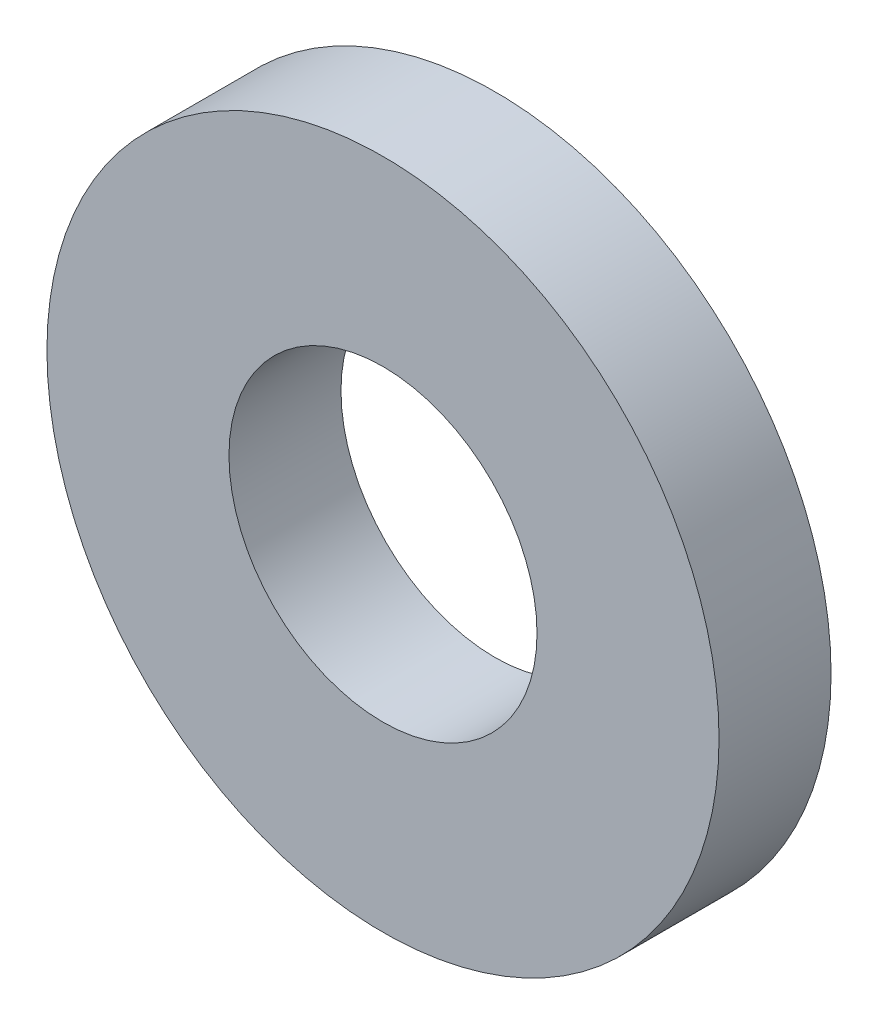
ISO-10303-21;
HEADER;
FILE_DESCRIPTION(('STEP AP214'),'2;1');
FILE_NAME('part.step','',(''),(''),'','','');
FILE_SCHEMA(('AUTOMOTIVE_DESIGN { 1 0 10303 214 1 1 1 1 }'));
ENDSEC;
DATA;
#1=APPLICATION_CONTEXT('core data for automotive mechanical design processes');
#2=APPLICATION_PROTOCOL_DEFINITION('international standard','automotive_design',2000,#1);
#3=PRODUCT_CONTEXT('',#1,'mechanical');
#4=PRODUCT('Part','Part','',(#3));
#5=PRODUCT_RELATED_PRODUCT_CATEGORY('part','',(#4));
#6=PRODUCT_DEFINITION_FORMATION('','',#4);
#7=PRODUCT_DEFINITION_CONTEXT('part definition',#1,'design');
#8=PRODUCT_DEFINITION('design','',#6,#7);
#9=PRODUCT_DEFINITION_SHAPE('','',#8);
#10=(LENGTH_UNIT() NAMED_UNIT(*) SI_UNIT(.MILLI.,.METRE.));
#11=(NAMED_UNIT(*) PLANE_ANGLE_UNIT() SI_UNIT($,.RADIAN.));
#12=(NAMED_UNIT(*) SI_UNIT($,.STERADIAN.) SOLID_ANGLE_UNIT());
#13=UNCERTAINTY_MEASURE_WITH_UNIT(LENGTH_MEASURE(1.E-05),#10,'distance_accuracy_value','');
#14=(GEOMETRIC_REPRESENTATION_CONTEXT(3) GLOBAL_UNCERTAINTY_ASSIGNED_CONTEXT((#13)) GLOBAL_UNIT_ASSIGNED_CONTEXT((#10,
#11,#12)) REPRESENTATION_CONTEXT('',''));
#15=CARTESIAN_POINT('',(0.,0.,0.));
#16=DIRECTION('',(0.,0.,1.));
#17=DIRECTION('',(1.,0.,0.));
#18=AXIS2_PLACEMENT_3D('',#15,#16,#17);
#19=CARTESIAN_POINT('',(0.,0.,2.));
#20=DIRECTION('',(0.,0.,1.));
#21=DIRECTION('',(1.,0.,0.));
#22=AXIS2_PLACEMENT_3D('',#19,#20,#21);
#23=PLANE('',#22);
#24=CARTESIAN_POINT('',(0.,0.,2.));
#25=DIRECTION('',(0.,0.,1.));
#26=DIRECTION('',(1.,0.,0.));
#27=AXIS2_PLACEMENT_3D('',#24,#25,#26);
#28=CIRCLE('',#27,6.);
#29=CARTESIAN_POINT('',(6.,0.,2.));
#30=VERTEX_POINT('',#29);
#31=EDGE_CURVE('E10',#30,#30,#28,.T.);
#32=ORIENTED_EDGE('',*,*,#31,.T.);
#33=EDGE_LOOP('',(#32));
#34=FACE_BOUND('',#33,.T.);
#35=CARTESIAN_POINT('',(0.,0.,2.));
#36=DIRECTION('',(0.,0.,1.));
#37=DIRECTION('',(1.,0.,0.));
#38=AXIS2_PLACEMENT_3D('',#35,#36,#37);
#39=CIRCLE('',#38,2.75);
#40=CARTESIAN_POINT('',(2.75,0.,2.));
#41=VERTEX_POINT('',#40);
#42=EDGE_CURVE('E44',#41,#41,#39,.T.);
#43=ORIENTED_EDGE('',*,*,#42,.F.);
#44=EDGE_LOOP('',(#43));
#45=FACE_BOUND('',#44,.T.);
#46=ADVANCED_FACE('F33',(#34,#45),#23,.T.);
#47=CARTESIAN_POINT('',(0.,0.,0.));
#48=DIRECTION('',(0.,0.,1.));
#49=DIRECTION('',(1.,0.,0.));
#50=AXIS2_PLACEMENT_3D('',#47,#48,#49);
#51=PLANE('',#50);
#52=CARTESIAN_POINT('',(0.,0.,0.));
#53=DIRECTION('',(0.,0.,1.));
#54=DIRECTION('',(1.,0.,0.));
#55=AXIS2_PLACEMENT_3D('',#52,#53,#54);
#56=CIRCLE('',#55,6.);
#57=CARTESIAN_POINT('',(6.,0.,0.));
#58=VERTEX_POINT('',#57);
#59=EDGE_CURVE('E37',#58,#58,#56,.T.);
#60=ORIENTED_EDGE('',*,*,#59,.F.);
#61=EDGE_LOOP('',(#60));
#62=FACE_BOUND('',#61,.T.);
#63=CARTESIAN_POINT('',(0.,0.,0.));
#64=DIRECTION('',(0.,0.,1.));
#65=DIRECTION('',(1.,0.,0.));
#66=AXIS2_PLACEMENT_3D('',#63,#64,#65);
#67=CIRCLE('',#66,2.75);
#68=CARTESIAN_POINT('',(2.75,0.,0.));
#69=VERTEX_POINT('',#68);
#70=EDGE_CURVE('E46',#69,#69,#67,.T.);
#71=ORIENTED_EDGE('',*,*,#70,.T.);
#72=EDGE_LOOP('',(#71));
#73=FACE_BOUND('',#72,.T.);
#74=ADVANCED_FACE('F56',(#62,#73),#51,.F.);
#75=CARTESIAN_POINT('',(0.,0.,2.));
#76=DIRECTION('',(0.,0.,-1.));
#77=DIRECTION('',(-1.,0.,0.));
#78=AXIS2_PLACEMENT_3D('',#75,#76,#77);
#79=CYLINDRICAL_SURFACE('',#78,6.);
#80=ORIENTED_EDGE('',*,*,#31,.F.);
#81=EDGE_LOOP('',(#80));
#82=FACE_BOUND('',#81,.T.);
#83=ORIENTED_EDGE('',*,*,#59,.T.);
#84=EDGE_LOOP('',(#83));
#85=FACE_BOUND('',#84,.T.);
#86=ADVANCED_FACE('F35',(#82,#85),#79,.T.);
#87=CARTESIAN_POINT('',(0.,0.,2.));
#88=DIRECTION('',(0.,0.,-1.));
#89=DIRECTION('',(-1.,0.,0.));
#90=AXIS2_PLACEMENT_3D('',#87,#88,#89);
#91=CYLINDRICAL_SURFACE('',#90,2.75);
#92=ORIENTED_EDGE('',*,*,#42,.T.);
#93=EDGE_LOOP('',(#92));
#94=FACE_BOUND('',#93,.T.);
#95=ORIENTED_EDGE('',*,*,#70,.F.);
#96=EDGE_LOOP('',(#95));
#97=FACE_BOUND('',#96,.T.);
#98=ADVANCED_FACE('F52',(#94,#97),#91,.F.);
#99=CLOSED_SHELL('',(#46,#74,#86,#98));
#100=MANIFOLD_SOLID_BREP('B2',#99);
#101=ADVANCED_BREP_SHAPE_REPRESENTATION('',(#18,#100),#14);
#102=SHAPE_DEFINITION_REPRESENTATION(#9,#101);
ENDSEC;
END-ISO-10303-21;
